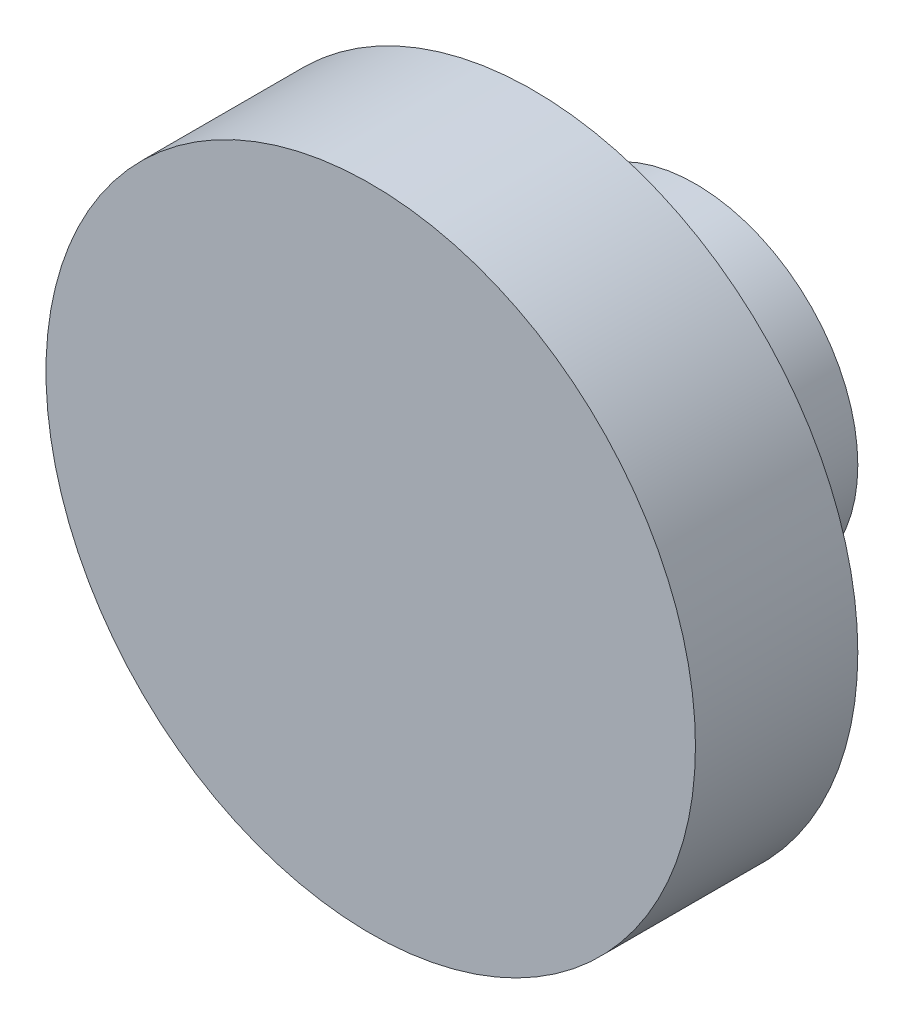
ISO-10303-21;
HEADER;
FILE_DESCRIPTION(('STEP AP214'),'2;1');
FILE_NAME('part.step','',(''),(''),'','','');
FILE_SCHEMA(('AUTOMOTIVE_DESIGN { 1 0 10303 214 1 1 1 1 }'));
ENDSEC;
DATA;
#1=APPLICATION_CONTEXT('core data for automotive mechanical design processes');
#2=APPLICATION_PROTOCOL_DEFINITION('international standard','automotive_design',2000,#1);
#3=PRODUCT_CONTEXT('',#1,'mechanical');
#4=PRODUCT('Part','Part','',(#3));
#5=PRODUCT_RELATED_PRODUCT_CATEGORY('part','',(#4));
#6=PRODUCT_DEFINITION_FORMATION('','',#4);
#7=PRODUCT_DEFINITION_CONTEXT('part definition',#1,'design');
#8=PRODUCT_DEFINITION('design','',#6,#7);
#9=PRODUCT_DEFINITION_SHAPE('','',#8);
#10=(LENGTH_UNIT() NAMED_UNIT(*) SI_UNIT(.MILLI.,.METRE.));
#11=(NAMED_UNIT(*) PLANE_ANGLE_UNIT() SI_UNIT($,.RADIAN.));
#12=(NAMED_UNIT(*) SI_UNIT($,.STERADIAN.) SOLID_ANGLE_UNIT());
#13=UNCERTAINTY_MEASURE_WITH_UNIT(LENGTH_MEASURE(1.E-05),#10,'distance_accuracy_value','');
#14=(GEOMETRIC_REPRESENTATION_CONTEXT(3) GLOBAL_UNCERTAINTY_ASSIGNED_CONTEXT((#13)) GLOBAL_UNIT_ASSIGNED_CONTEXT((#10,
#11,#12)) REPRESENTATION_CONTEXT('',''));
#15=CARTESIAN_POINT('',(0.,0.,0.));
#16=DIRECTION('',(0.,0.,1.));
#17=DIRECTION('',(1.,0.,0.));
#18=AXIS2_PLACEMENT_3D('',#15,#16,#17);
#19=CARTESIAN_POINT('',(0.,0.,0.));
#20=DIRECTION('',(0.,0.,1.));
#21=DIRECTION('',(1.,0.,0.));
#22=AXIS2_PLACEMENT_3D('',#19,#20,#21);
#23=PLANE('',#22);
#24=CARTESIAN_POINT('',(0.,0.,0.));
#25=DIRECTION('',(0.,0.,1.));
#26=DIRECTION('',(1.,0.,0.));
#27=AXIS2_PLACEMENT_3D('',#24,#25,#26);
#28=CIRCLE('',#27,15.);
#29=CARTESIAN_POINT('',(15.,0.,0.));
#30=VERTEX_POINT('',#29);
#31=EDGE_CURVE('E38',#30,#30,#28,.T.);
#32=ORIENTED_EDGE('',*,*,#31,.F.);
#33=EDGE_LOOP('',(#32));
#34=FACE_BOUND('',#33,.T.);
#35=CARTESIAN_POINT('',(0.,0.,0.));
#36=DIRECTION('',(0.,0.,1.));
#37=DIRECTION('',(1.,0.,0.));
#38=AXIS2_PLACEMENT_3D('',#35,#36,#37);
#39=CIRCLE('',#38,7.5);
#40=CARTESIAN_POINT('',(7.5,0.,0.));
#41=VERTEX_POINT('',#40);
#42=EDGE_CURVE('E45',#41,#41,#39,.T.);
#43=ORIENTED_EDGE('',*,*,#42,.T.);
#44=EDGE_LOOP('',(#43));
#45=FACE_BOUND('',#44,.T.);
#46=ADVANCED_FACE('F34',(#34,#45),#23,.F.);
#47=CARTESIAN_POINT('',(0.,0.,15.));
#48=DIRECTION('',(0.,0.,-1.));
#49=DIRECTION('',(-1.,0.,0.));
#50=AXIS2_PLACEMENT_3D('',#47,#48,#49);
#51=CYLINDRICAL_SURFACE('',#50,15.);
#52=CARTESIAN_POINT('',(0.,0.,15.));
#53=DIRECTION('',(0.,0.,1.));
#54=DIRECTION('',(1.,0.,0.));
#55=AXIS2_PLACEMENT_3D('',#52,#53,#54);
#56=CIRCLE('',#55,15.);
#57=CARTESIAN_POINT('',(15.,0.,15.));
#58=VERTEX_POINT('',#57);
#59=EDGE_CURVE('E10',#58,#58,#56,.T.);
#60=ORIENTED_EDGE('',*,*,#59,.F.);
#61=EDGE_LOOP('',(#60));
#62=FACE_BOUND('',#61,.T.);
#63=ORIENTED_EDGE('',*,*,#31,.T.);
#64=EDGE_LOOP('',(#63));
#65=FACE_BOUND('',#64,.T.);
#66=ADVANCED_FACE('F36',(#62,#65),#51,.T.);
#67=CARTESIAN_POINT('',(0.,0.,15.));
#68=DIRECTION('',(0.,0.,-1.));
#69=DIRECTION('',(-1.,0.,0.));
#70=AXIS2_PLACEMENT_3D('',#67,#68,#69);
#71=CYLINDRICAL_SURFACE('',#70,7.5);
#72=CARTESIAN_POINT('',(0.,0.,15.));
#73=DIRECTION('',(0.,0.,1.));
#74=DIRECTION('',(1.,0.,0.));
#75=AXIS2_PLACEMENT_3D('',#72,#73,#74);
#76=CIRCLE('',#75,7.5);
#77=CARTESIAN_POINT('',(7.5,0.,15.));
#78=VERTEX_POINT('',#77);
#79=EDGE_CURVE('E49',#78,#78,#76,.T.);
#80=ORIENTED_EDGE('',*,*,#79,.T.);
#81=EDGE_LOOP('',(#80));
#82=FACE_BOUND('',#81,.T.);
#83=ORIENTED_EDGE('',*,*,#42,.F.);
#84=EDGE_LOOP('',(#83));
#85=FACE_BOUND('',#84,.T.);
#86=ADVANCED_FACE('F76',(#82,#85),#71,.F.);
#87=CARTESIAN_POINT('',(0.,0.,15.));
#88=DIRECTION('',(0.,0.,1.));
#89=DIRECTION('',(1.,0.,0.));
#90=AXIS2_PLACEMENT_3D('',#87,#88,#89);
#91=PLANE('',#90);
#92=ORIENTED_EDGE('',*,*,#79,.F.);
#93=EDGE_LOOP('',(#92));
#94=FACE_BOUND('',#93,.T.);
#95=ADVANCED_FACE('F64',(#94),#91,.F.);
#96=CARTESIAN_POINT('',(0.,0.,30.));
#97=DIRECTION('',(0.,0.,-1.));
#98=DIRECTION('',(-1.,0.,0.));
#99=AXIS2_PLACEMENT_3D('',#96,#97,#98);
#100=CYLINDRICAL_SURFACE('',#99,30.);
#101=CARTESIAN_POINT('',(0.,0.,30.));
#102=DIRECTION('',(0.,0.,1.));
#103=DIRECTION('',(1.,0.,0.));
#104=AXIS2_PLACEMENT_3D('',#101,#102,#103);
#105=CIRCLE('',#104,30.);
#106=CARTESIAN_POINT('',(30.,0.,30.));
#107=VERTEX_POINT('',#106);
#108=EDGE_CURVE('E52',#107,#107,#105,.T.);
#109=ORIENTED_EDGE('',*,*,#108,.F.);
#110=EDGE_LOOP('',(#109));
#111=FACE_BOUND('',#110,.T.);
#112=CARTESIAN_POINT('',(0.,0.,15.));
#113=DIRECTION('',(0.,0.,1.));
#114=DIRECTION('',(1.,0.,0.));
#115=AXIS2_PLACEMENT_3D('',#112,#113,#114);
#116=CIRCLE('',#115,30.);
#117=CARTESIAN_POINT('',(30.,0.,15.));
#118=VERTEX_POINT('',#117);
#119=EDGE_CURVE('E53',#118,#118,#116,.T.);
#120=ORIENTED_EDGE('',*,*,#119,.T.);
#121=EDGE_LOOP('',(#120));
#122=FACE_BOUND('',#121,.T.);
#123=ADVANCED_FACE('F61',(#111,#122),#100,.T.);
#124=CARTESIAN_POINT('',(0.,0.,30.));
#125=DIRECTION('',(0.,0.,1.));
#126=DIRECTION('',(1.,0.,0.));
#127=AXIS2_PLACEMENT_3D('',#124,#125,#126);
#128=PLANE('',#127);
#129=ORIENTED_EDGE('',*,*,#108,.T.);
#130=EDGE_LOOP('',(#129));
#131=FACE_BOUND('',#130,.T.);
#132=ADVANCED_FACE('F59',(#131),#128,.T.);
#133=ORIENTED_EDGE('',*,*,#59,.T.);
#134=EDGE_LOOP('',(#133));
#135=FACE_BOUND('',#134,.T.);
#136=ORIENTED_EDGE('',*,*,#119,.F.);
#137=EDGE_LOOP('',(#136));
#138=FACE_BOUND('',#137,.T.);
#139=ADVANCED_FACE('F68',(#135,#138),#91,.F.);
#140=CLOSED_SHELL('',(#46,#66,#86,#95,#123,#132,#139));
#141=MANIFOLD_SOLID_BREP('B2',#140);
#142=ADVANCED_BREP_SHAPE_REPRESENTATION('',(#18,#141),#14);
#143=SHAPE_DEFINITION_REPRESENTATION(#9,#142);
ENDSEC;
END-ISO-10303-21;
